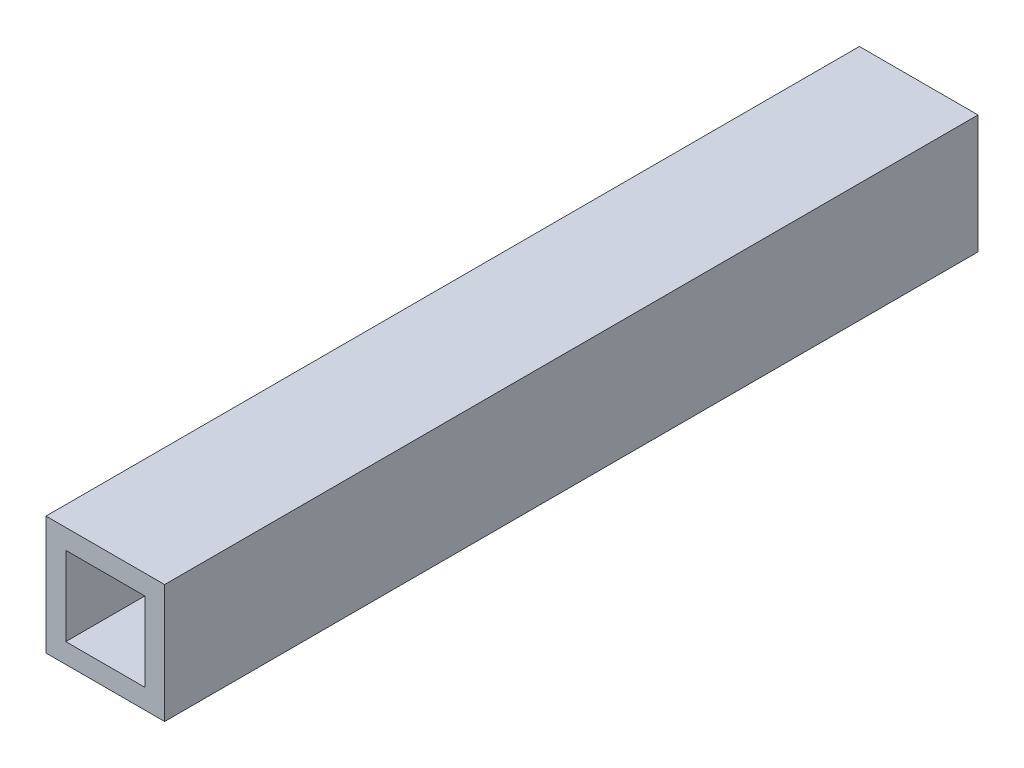
ISO-10303-21;
HEADER;
FILE_DESCRIPTION(('STEP AP214'),'2;1');
FILE_NAME('part.step','',(''),(''),'','','');
FILE_SCHEMA(('AUTOMOTIVE_DESIGN { 1 0 10303 214 1 1 1 1 }'));
ENDSEC;
DATA;
#1=APPLICATION_CONTEXT('core data for automotive mechanical design processes');
#2=APPLICATION_PROTOCOL_DEFINITION('international standard','automotive_design',2000,#1);
#3=PRODUCT_CONTEXT('',#1,'mechanical');
#4=PRODUCT('Part','Part','',(#3));
#5=PRODUCT_RELATED_PRODUCT_CATEGORY('part','',(#4));
#6=PRODUCT_DEFINITION_FORMATION('','',#4);
#7=PRODUCT_DEFINITION_CONTEXT('part definition',#1,'design');
#8=PRODUCT_DEFINITION('design','',#6,#7);
#9=PRODUCT_DEFINITION_SHAPE('','',#8);
#10=(LENGTH_UNIT() NAMED_UNIT(*) SI_UNIT(.MILLI.,.METRE.));
#11=(NAMED_UNIT(*) PLANE_ANGLE_UNIT() SI_UNIT($,.RADIAN.));
#12=(NAMED_UNIT(*) SI_UNIT($,.STERADIAN.) SOLID_ANGLE_UNIT());
#13=UNCERTAINTY_MEASURE_WITH_UNIT(LENGTH_MEASURE(1.E-05),#10,'distance_accuracy_value','');
#14=(GEOMETRIC_REPRESENTATION_CONTEXT(3) GLOBAL_UNCERTAINTY_ASSIGNED_CONTEXT((#13)) GLOBAL_UNIT_ASSIGNED_CONTEXT((#10,
#11,#12)) REPRESENTATION_CONTEXT('',''));
#15=CARTESIAN_POINT('',(0.,0.,0.));
#16=DIRECTION('',(0.,0.,1.));
#17=DIRECTION('',(1.,0.,0.));
#18=AXIS2_PLACEMENT_3D('',#15,#16,#17);
#19=CARTESIAN_POINT('',(0.,0.,205.7));
#20=DIRECTION('',(0.,0.,1.));
#21=DIRECTION('',(1.,0.,0.));
#22=AXIS2_PLACEMENT_3D('',#19,#20,#21);
#23=PLANE('',#22);
#24=DIRECTION('',(0.,1.,0.));
#25=VECTOR('',#24,1.);
#26=CARTESIAN_POINT('',(15.,15.,205.7));
#27=LINE('',#26,#25);
#28=CARTESIAN_POINT('',(15.,-15.,205.7));
#29=VERTEX_POINT('',#28);
#30=CARTESIAN_POINT('',(15.,15.,205.7));
#31=VERTEX_POINT('',#30);
#32=EDGE_CURVE('E136',#29,#31,#27,.T.);
#33=ORIENTED_EDGE('',*,*,#32,.T.);
#34=DIRECTION('',(-1.,0.,0.));
#35=VECTOR('',#34,1.);
#36=CARTESIAN_POINT('',(-15.,15.,205.7));
#37=LINE('',#36,#35);
#38=CARTESIAN_POINT('',(-15.,15.,205.7));
#39=VERTEX_POINT('',#38);
#40=EDGE_CURVE('E139',#31,#39,#37,.T.);
#41=ORIENTED_EDGE('',*,*,#40,.T.);
#42=DIRECTION('',(0.,-1.,0.));
#43=VECTOR('',#42,1.);
#44=CARTESIAN_POINT('',(-15.,15.,205.7));
#45=LINE('',#44,#43);
#46=CARTESIAN_POINT('',(-15.,-15.,205.7));
#47=VERTEX_POINT('',#46);
#48=EDGE_CURVE('E142',#39,#47,#45,.T.);
#49=ORIENTED_EDGE('',*,*,#48,.T.);
#50=DIRECTION('',(1.,0.,0.));
#51=VECTOR('',#50,1.);
#52=CARTESIAN_POINT('',(-15.,-15.,205.7));
#53=LINE('',#52,#51);
#54=EDGE_CURVE('E144',#47,#29,#53,.T.);
#55=ORIENTED_EDGE('',*,*,#54,.T.);
#56=EDGE_LOOP('',(#33,#41,#49,#55));
#57=FACE_BOUND('',#56,.T.);
#58=DIRECTION('',(-1.,0.,0.));
#59=VECTOR('',#58,1.);
#60=CARTESIAN_POINT('',(-10.,10.,205.7));
#61=LINE('',#60,#59);
#62=CARTESIAN_POINT('',(9.99999999999999,10.,205.7));
#63=VERTEX_POINT('',#62);
#64=CARTESIAN_POINT('',(-10.,10.,205.7));
#65=VERTEX_POINT('',#64);
#66=EDGE_CURVE('E108',#63,#65,#61,.T.);
#67=ORIENTED_EDGE('',*,*,#66,.F.);
#68=DIRECTION('',(0.,1.,0.));
#69=VECTOR('',#68,1.);
#70=CARTESIAN_POINT('',(9.99999999999999,10.,205.7));
#71=LINE('',#70,#69);
#72=CARTESIAN_POINT('',(9.99999999999999,-10.,205.7));
#73=VERTEX_POINT('',#72);
#74=EDGE_CURVE('E100',#73,#63,#71,.T.);
#75=ORIENTED_EDGE('',*,*,#74,.F.);
#76=DIRECTION('',(1.,0.,0.));
#77=VECTOR('',#76,1.);
#78=CARTESIAN_POINT('',(-10.,-10.,205.7));
#79=LINE('',#78,#77);
#80=CARTESIAN_POINT('',(-10.,-10.,205.7));
#81=VERTEX_POINT('',#80);
#82=EDGE_CURVE('E122',#81,#73,#79,.T.);
#83=ORIENTED_EDGE('',*,*,#82,.F.);
#84=DIRECTION('',(0.,-1.,0.));
#85=VECTOR('',#84,1.);
#86=CARTESIAN_POINT('',(-10.,10.,205.7));
#87=LINE('',#86,#85);
#88=EDGE_CURVE('E120',#65,#81,#87,.T.);
#89=ORIENTED_EDGE('',*,*,#88,.F.);
#90=EDGE_LOOP('',(#67,#75,#83,#89));
#91=FACE_BOUND('',#90,.T.);
#92=ADVANCED_FACE('F35',(#57,#91),#23,.T.);
#93=CARTESIAN_POINT('',(0.,0.,0.));
#94=DIRECTION('',(0.,0.,1.));
#95=DIRECTION('',(1.,0.,0.));
#96=AXIS2_PLACEMENT_3D('',#93,#94,#95);
#97=PLANE('',#96);
#98=DIRECTION('',(0.,1.,0.));
#99=VECTOR('',#98,1.);
#100=CARTESIAN_POINT('',(15.,15.,0.));
#101=LINE('',#100,#99);
#102=CARTESIAN_POINT('',(15.,-15.,0.));
#103=VERTEX_POINT('',#102);
#104=CARTESIAN_POINT('',(15.,15.,0.));
#105=VERTEX_POINT('',#104);
#106=EDGE_CURVE('E116',#103,#105,#101,.T.);
#107=ORIENTED_EDGE('',*,*,#106,.F.);
#108=DIRECTION('',(1.,0.,0.));
#109=VECTOR('',#108,1.);
#110=CARTESIAN_POINT('',(-15.,-15.,0.));
#111=LINE('',#110,#109);
#112=CARTESIAN_POINT('',(-15.,-15.,0.));
#113=VERTEX_POINT('',#112);
#114=EDGE_CURVE('E140',#113,#103,#111,.T.);
#115=ORIENTED_EDGE('',*,*,#114,.F.);
#116=DIRECTION('',(0.,-1.,0.));
#117=VECTOR('',#116,1.);
#118=CARTESIAN_POINT('',(-15.,15.,0.));
#119=LINE('',#118,#117);
#120=CARTESIAN_POINT('',(-15.,15.,0.));
#121=VERTEX_POINT('',#120);
#122=EDGE_CURVE('E151',#121,#113,#119,.T.);
#123=ORIENTED_EDGE('',*,*,#122,.F.);
#124=DIRECTION('',(-1.,0.,0.));
#125=VECTOR('',#124,1.);
#126=CARTESIAN_POINT('',(-15.,15.,0.));
#127=LINE('',#126,#125);
#128=EDGE_CURVE('E149',#105,#121,#127,.T.);
#129=ORIENTED_EDGE('',*,*,#128,.F.);
#130=EDGE_LOOP('',(#107,#115,#123,#129));
#131=FACE_BOUND('',#130,.T.);
#132=DIRECTION('',(0.,1.,0.));
#133=VECTOR('',#132,1.);
#134=CARTESIAN_POINT('',(9.99999999999999,10.,0.));
#135=LINE('',#134,#133);
#136=CARTESIAN_POINT('',(9.99999999999999,-10.,0.));
#137=VERTEX_POINT('',#136);
#138=CARTESIAN_POINT('',(9.99999999999999,10.,0.));
#139=VERTEX_POINT('',#138);
#140=EDGE_CURVE('E58',#137,#139,#135,.T.);
#141=ORIENTED_EDGE('',*,*,#140,.T.);
#142=DIRECTION('',(-1.,0.,0.));
#143=VECTOR('',#142,1.);
#144=CARTESIAN_POINT('',(-10.,10.,0.));
#145=LINE('',#144,#143);
#146=CARTESIAN_POINT('',(-10.,10.,0.));
#147=VERTEX_POINT('',#146);
#148=EDGE_CURVE('E115',#139,#147,#145,.T.);
#149=ORIENTED_EDGE('',*,*,#148,.T.);
#150=DIRECTION('',(0.,-1.,0.));
#151=VECTOR('',#150,1.);
#152=CARTESIAN_POINT('',(-10.,10.,0.));
#153=LINE('',#152,#151);
#154=CARTESIAN_POINT('',(-10.,-10.,0.));
#155=VERTEX_POINT('',#154);
#156=EDGE_CURVE('E128',#147,#155,#153,.T.);
#157=ORIENTED_EDGE('',*,*,#156,.T.);
#158=DIRECTION('',(1.,0.,0.));
#159=VECTOR('',#158,1.);
#160=CARTESIAN_POINT('',(-10.,-10.,0.));
#161=LINE('',#160,#159);
#162=EDGE_CURVE('E109',#155,#137,#161,.T.);
#163=ORIENTED_EDGE('',*,*,#162,.T.);
#164=EDGE_LOOP('',(#141,#149,#157,#163));
#165=FACE_BOUND('',#164,.T.);
#166=ADVANCED_FACE('F169',(#131,#165),#97,.F.);
#167=CARTESIAN_POINT('',(15.,15.,205.7));
#168=DIRECTION('',(-1.,0.,0.));
#169=DIRECTION('',(0.,0.,1.));
#170=AXIS2_PLACEMENT_3D('',#167,#168,#169);
#171=PLANE('',#170);
#172=ORIENTED_EDGE('',*,*,#106,.T.);
#173=DIRECTION('',(0.,0.,-1.));
#174=VECTOR('',#173,1.);
#175=CARTESIAN_POINT('',(15.,15.,205.7));
#176=LINE('',#175,#174);
#177=EDGE_CURVE('E11',#31,#105,#176,.T.);
#178=ORIENTED_EDGE('',*,*,#177,.F.);
#179=ORIENTED_EDGE('',*,*,#32,.F.);
#180=DIRECTION('',(0.,0.,-1.));
#181=VECTOR('',#180,1.);
#182=CARTESIAN_POINT('',(15.,-15.,205.7));
#183=LINE('',#182,#181);
#184=EDGE_CURVE('E146',#29,#103,#183,.T.);
#185=ORIENTED_EDGE('',*,*,#184,.T.);
#186=EDGE_LOOP('',(#172,#178,#179,#185));
#187=FACE_BOUND('',#186,.T.);
#188=ADVANCED_FACE('F37',(#187),#171,.F.);
#189=CARTESIAN_POINT('',(-15.,15.,205.7));
#190=DIRECTION('',(0.,-1.,0.));
#191=DIRECTION('',(0.,0.,-1.));
#192=AXIS2_PLACEMENT_3D('',#189,#190,#191);
#193=PLANE('',#192);
#194=ORIENTED_EDGE('',*,*,#128,.T.);
#195=DIRECTION('',(0.,0.,-1.));
#196=VECTOR('',#195,1.);
#197=CARTESIAN_POINT('',(-15.,15.,205.7));
#198=LINE('',#197,#196);
#199=EDGE_CURVE('E43',#39,#121,#198,.T.);
#200=ORIENTED_EDGE('',*,*,#199,.F.);
#201=ORIENTED_EDGE('',*,*,#40,.F.);
#202=ORIENTED_EDGE('',*,*,#177,.T.);
#203=EDGE_LOOP('',(#194,#200,#201,#202));
#204=FACE_BOUND('',#203,.T.);
#205=ADVANCED_FACE('F179',(#204),#193,.F.);
#206=CARTESIAN_POINT('',(-15.,15.,205.7));
#207=DIRECTION('',(1.,0.,0.));
#208=DIRECTION('',(0.,0.,-1.));
#209=AXIS2_PLACEMENT_3D('',#206,#207,#208);
#210=PLANE('',#209);
#211=ORIENTED_EDGE('',*,*,#122,.T.);
#212=DIRECTION('',(0.,0.,-1.));
#213=VECTOR('',#212,1.);
#214=CARTESIAN_POINT('',(-15.,-15.,205.7));
#215=LINE('',#214,#213);
#216=EDGE_CURVE('E156',#47,#113,#215,.T.);
#217=ORIENTED_EDGE('',*,*,#216,.F.);
#218=ORIENTED_EDGE('',*,*,#48,.F.);
#219=ORIENTED_EDGE('',*,*,#199,.T.);
#220=EDGE_LOOP('',(#211,#217,#218,#219));
#221=FACE_BOUND('',#220,.T.);
#222=ADVANCED_FACE('F163',(#221),#210,.F.);
#223=CARTESIAN_POINT('',(-15.,-15.,205.7));
#224=DIRECTION('',(0.,1.,0.));
#225=DIRECTION('',(0.,0.,1.));
#226=AXIS2_PLACEMENT_3D('',#223,#224,#225);
#227=PLANE('',#226);
#228=ORIENTED_EDGE('',*,*,#114,.T.);
#229=ORIENTED_EDGE('',*,*,#184,.F.);
#230=ORIENTED_EDGE('',*,*,#54,.F.);
#231=ORIENTED_EDGE('',*,*,#216,.T.);
#232=EDGE_LOOP('',(#228,#229,#230,#231));
#233=FACE_BOUND('',#232,.T.);
#234=ADVANCED_FACE('F173',(#233),#227,.F.);
#235=CARTESIAN_POINT('',(9.99999999999999,10.,205.7));
#236=DIRECTION('',(-1.,0.,0.));
#237=DIRECTION('',(0.,0.,1.));
#238=AXIS2_PLACEMENT_3D('',#235,#236,#237);
#239=PLANE('',#238);
#240=ORIENTED_EDGE('',*,*,#140,.F.);
#241=DIRECTION('',(0.,0.,-1.));
#242=VECTOR('',#241,1.);
#243=CARTESIAN_POINT('',(9.99999999999999,-10.,205.7));
#244=LINE('',#243,#242);
#245=EDGE_CURVE('E104',#73,#137,#244,.T.);
#246=ORIENTED_EDGE('',*,*,#245,.F.);
#247=ORIENTED_EDGE('',*,*,#74,.T.);
#248=DIRECTION('',(0.,0.,-1.));
#249=VECTOR('',#248,1.);
#250=CARTESIAN_POINT('',(9.99999999999999,10.,205.7));
#251=LINE('',#250,#249);
#252=EDGE_CURVE('E103',#63,#139,#251,.T.);
#253=ORIENTED_EDGE('',*,*,#252,.T.);
#254=EDGE_LOOP('',(#240,#246,#247,#253));
#255=FACE_BOUND('',#254,.T.);
#256=ADVANCED_FACE('F102',(#255),#239,.T.);
#257=CARTESIAN_POINT('',(-10.,10.,205.7));
#258=DIRECTION('',(0.,-1.,0.));
#259=DIRECTION('',(0.,0.,-1.));
#260=AXIS2_PLACEMENT_3D('',#257,#258,#259);
#261=PLANE('',#260);
#262=ORIENTED_EDGE('',*,*,#148,.F.);
#263=ORIENTED_EDGE('',*,*,#252,.F.);
#264=ORIENTED_EDGE('',*,*,#66,.T.);
#265=DIRECTION('',(0.,0.,-1.));
#266=VECTOR('',#265,1.);
#267=CARTESIAN_POINT('',(-10.,10.,205.7));
#268=LINE('',#267,#266);
#269=EDGE_CURVE('E117',#65,#147,#268,.T.);
#270=ORIENTED_EDGE('',*,*,#269,.T.);
#271=EDGE_LOOP('',(#262,#263,#264,#270));
#272=FACE_BOUND('',#271,.T.);
#273=ADVANCED_FACE('F112',(#272),#261,.T.);
#274=CARTESIAN_POINT('',(-10.,10.,205.7));
#275=DIRECTION('',(1.,0.,0.));
#276=DIRECTION('',(0.,0.,-1.));
#277=AXIS2_PLACEMENT_3D('',#274,#275,#276);
#278=PLANE('',#277);
#279=ORIENTED_EDGE('',*,*,#156,.F.);
#280=ORIENTED_EDGE('',*,*,#269,.F.);
#281=ORIENTED_EDGE('',*,*,#88,.T.);
#282=DIRECTION('',(0.,0.,-1.));
#283=VECTOR('',#282,1.);
#284=CARTESIAN_POINT('',(-10.,-10.,205.7));
#285=LINE('',#284,#283);
#286=EDGE_CURVE('E50',#81,#155,#285,.T.);
#287=ORIENTED_EDGE('',*,*,#286,.T.);
#288=EDGE_LOOP('',(#279,#280,#281,#287));
#289=FACE_BOUND('',#288,.T.);
#290=ADVANCED_FACE('F202',(#289),#278,.T.);
#291=CARTESIAN_POINT('',(-10.,-10.,205.7));
#292=DIRECTION('',(0.,1.,0.));
#293=DIRECTION('',(0.,0.,1.));
#294=AXIS2_PLACEMENT_3D('',#291,#292,#293);
#295=PLANE('',#294);
#296=ORIENTED_EDGE('',*,*,#162,.F.);
#297=ORIENTED_EDGE('',*,*,#286,.F.);
#298=ORIENTED_EDGE('',*,*,#82,.T.);
#299=ORIENTED_EDGE('',*,*,#245,.T.);
#300=EDGE_LOOP('',(#296,#297,#298,#299));
#301=FACE_BOUND('',#300,.T.);
#302=ADVANCED_FACE('F206',(#301),#295,.T.);
#303=CLOSED_SHELL('',(#92,#166,#188,#205,#222,#234,#256,#273,#290,#302));
#304=MANIFOLD_SOLID_BREP('B2',#303);
#305=ADVANCED_BREP_SHAPE_REPRESENTATION('',(#18,#304),#14);
#306=SHAPE_DEFINITION_REPRESENTATION(#9,#305);
ENDSEC;
END-ISO-10303-21;
